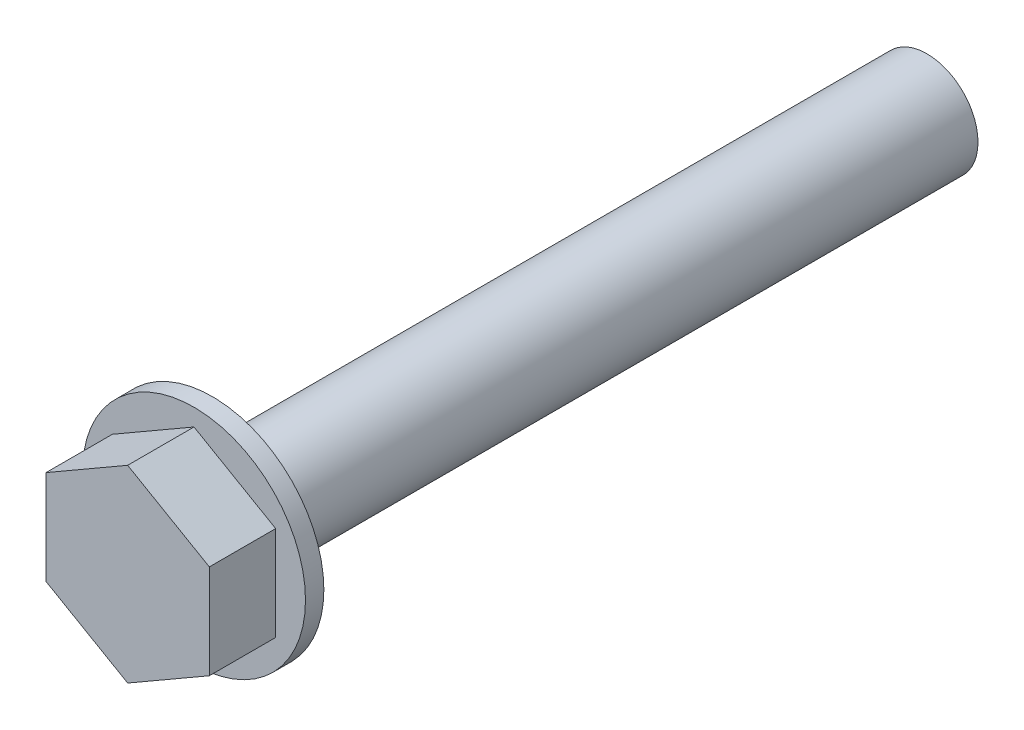
ISO-10303-21;
HEADER;
FILE_DESCRIPTION(('STEP AP214'),'2;1');
FILE_NAME('part.step','',(''),(''),'','','');
FILE_SCHEMA(('AUTOMOTIVE_DESIGN { 1 0 10303 214 1 1 1 1 }'));
ENDSEC;
DATA;
#1=APPLICATION_CONTEXT('core data for automotive mechanical design processes');
#2=APPLICATION_PROTOCOL_DEFINITION('international standard','automotive_design',2000,#1);
#3=PRODUCT_CONTEXT('',#1,'mechanical');
#4=PRODUCT('Part','Part','',(#3));
#5=PRODUCT_RELATED_PRODUCT_CATEGORY('part','',(#4));
#6=PRODUCT_DEFINITION_FORMATION('','',#4);
#7=PRODUCT_DEFINITION_CONTEXT('part definition',#1,'design');
#8=PRODUCT_DEFINITION('design','',#6,#7);
#9=PRODUCT_DEFINITION_SHAPE('','',#8);
#10=(LENGTH_UNIT() NAMED_UNIT(*) SI_UNIT(.MILLI.,.METRE.));
#11=(NAMED_UNIT(*) PLANE_ANGLE_UNIT() SI_UNIT($,.RADIAN.));
#12=(NAMED_UNIT(*) SI_UNIT($,.STERADIAN.) SOLID_ANGLE_UNIT());
#13=UNCERTAINTY_MEASURE_WITH_UNIT(LENGTH_MEASURE(1.E-05),#10,'distance_accuracy_value','');
#14=(GEOMETRIC_REPRESENTATION_CONTEXT(3) GLOBAL_UNCERTAINTY_ASSIGNED_CONTEXT((#13)) GLOBAL_UNIT_ASSIGNED_CONTEXT((#10,
#11,#12)) REPRESENTATION_CONTEXT('',''));
#15=CARTESIAN_POINT('',(0.,0.,0.));
#16=DIRECTION('',(0.,0.,1.));
#17=DIRECTION('',(1.,0.,0.));
#18=AXIS2_PLACEMENT_3D('',#15,#16,#17);
#19=CARTESIAN_POINT('',(0.,0.,1.8));
#20=DIRECTION('',(0.,0.,-1.));
#21=DIRECTION('',(-1.,0.,0.));
#22=AXIS2_PLACEMENT_3D('',#19,#20,#21);
#23=CYLINDRICAL_SURFACE('',#22,10.92);
#24=CARTESIAN_POINT('',(0.,0.,1.8));
#25=DIRECTION('',(0.,0.,1.));
#26=DIRECTION('',(1.,0.,0.));
#27=AXIS2_PLACEMENT_3D('',#24,#25,#26);
#28=CIRCLE('',#27,10.92);
#29=CARTESIAN_POINT('',(10.92,0.,1.8));
#30=VERTEX_POINT('',#29);
#31=EDGE_CURVE('E48',#30,#30,#28,.T.);
#32=ORIENTED_EDGE('',*,*,#31,.F.);
#33=EDGE_LOOP('',(#32));
#34=FACE_BOUND('',#33,.T.);
#35=CARTESIAN_POINT('',(0.,0.,0.));
#36=DIRECTION('',(0.,0.,1.));
#37=DIRECTION('',(1.,0.,0.));
#38=AXIS2_PLACEMENT_3D('',#35,#36,#37);
#39=CIRCLE('',#38,10.92);
#40=CARTESIAN_POINT('',(10.92,0.,0.));
#41=VERTEX_POINT('',#40);
#42=EDGE_CURVE('E117',#41,#41,#39,.T.);
#43=ORIENTED_EDGE('',*,*,#42,.T.);
#44=EDGE_LOOP('',(#43));
#45=FACE_BOUND('',#44,.T.);
#46=ADVANCED_FACE('F41',(#34,#45),#23,.T.);
#47=CARTESIAN_POINT('',(0.,0.,1.8));
#48=DIRECTION('',(0.,0.,1.));
#49=DIRECTION('',(1.,0.,0.));
#50=AXIS2_PLACEMENT_3D('',#47,#48,#49);
#51=PLANE('',#50);
#52=DIRECTION('',(0.,1.,0.));
#53=VECTOR('',#52,1.);
#54=CARTESIAN_POINT('',(8.,-4.618802153517,1.8));
#55=LINE('',#54,#53);
#56=CARTESIAN_POINT('',(8.,-4.618802153517,1.8));
#57=VERTEX_POINT('',#56);
#58=CARTESIAN_POINT('',(8.,4.61880215351701,1.8));
#59=VERTEX_POINT('',#58);
#60=EDGE_CURVE('E54',#57,#59,#55,.T.);
#61=ORIENTED_EDGE('',*,*,#60,.F.);
#62=DIRECTION('',(0.866025403784438,0.5,0.));
#63=VECTOR('',#62,1.);
#64=CARTESIAN_POINT('',(0.,-9.23760430703402,1.8));
#65=LINE('',#64,#63);
#66=CARTESIAN_POINT('',(0.,-9.23760430703402,1.8));
#67=VERTEX_POINT('',#66);
#68=EDGE_CURVE('E56',#67,#57,#65,.T.);
#69=ORIENTED_EDGE('',*,*,#68,.F.);
#70=DIRECTION('',(0.866025403784438,-0.5,0.));
#71=VECTOR('',#70,1.);
#72=CARTESIAN_POINT('',(-8.,-4.618802153517,1.8));
#73=LINE('',#72,#71);
#74=CARTESIAN_POINT('',(-8.,-4.618802153517,1.8));
#75=VERTEX_POINT('',#74);
#76=EDGE_CURVE('E254',#75,#67,#73,.T.);
#77=ORIENTED_EDGE('',*,*,#76,.F.);
#78=DIRECTION('',(0.,-1.,0.));
#79=VECTOR('',#78,1.);
#80=CARTESIAN_POINT('',(-8.,4.61880215351701,1.8));
#81=LINE('',#80,#79);
#82=CARTESIAN_POINT('',(-8.,4.61880215351701,1.8));
#83=VERTEX_POINT('',#82);
#84=EDGE_CURVE('E269',#83,#75,#81,.T.);
#85=ORIENTED_EDGE('',*,*,#84,.F.);
#86=DIRECTION('',(-0.866025403784439,-0.5,0.));
#87=VECTOR('',#86,1.);
#88=CARTESIAN_POINT('',(0.,9.23760430703402,1.8));
#89=LINE('',#88,#87);
#90=CARTESIAN_POINT('',(0.,9.23760430703402,1.8));
#91=VERTEX_POINT('',#90);
#92=EDGE_CURVE('E272',#91,#83,#89,.T.);
#93=ORIENTED_EDGE('',*,*,#92,.F.);
#94=DIRECTION('',(-0.866025403784439,0.5,0.));
#95=VECTOR('',#94,1.);
#96=CARTESIAN_POINT('',(8.,4.61880215351701,1.8));
#97=LINE('',#96,#95);
#98=EDGE_CURVE('E273',#59,#91,#97,.T.);
#99=ORIENTED_EDGE('',*,*,#98,.F.);
#100=EDGE_LOOP('',(#61,#69,#77,#85,#93,#99));
#101=FACE_BOUND('',#100,.T.);
#102=ORIENTED_EDGE('',*,*,#31,.T.);
#103=EDGE_LOOP('',(#102));
#104=FACE_BOUND('',#103,.T.);
#105=ADVANCED_FACE('F128',(#101,#104),#51,.T.);
#106=CARTESIAN_POINT('',(0.,0.,0.));
#107=DIRECTION('',(0.,0.,1.));
#108=DIRECTION('',(1.,0.,0.));
#109=AXIS2_PLACEMENT_3D('',#106,#107,#108);
#110=PLANE('',#109);
#111=CARTESIAN_POINT('',(0.,0.,0.));
#112=DIRECTION('',(0.,0.,1.));
#113=DIRECTION('',(1.,0.,0.));
#114=AXIS2_PLACEMENT_3D('',#111,#112,#113);
#115=CIRCLE('',#114,5.);
#116=CARTESIAN_POINT('',(5.,0.,0.));
#117=VERTEX_POINT('',#116);
#118=EDGE_CURVE('E11',#117,#117,#115,.F.);
#119=ORIENTED_EDGE('',*,*,#118,.F.);
#120=EDGE_LOOP('',(#119));
#121=FACE_BOUND('',#120,.T.);
#122=ORIENTED_EDGE('',*,*,#42,.F.);
#123=EDGE_LOOP('',(#122));
#124=FACE_BOUND('',#123,.T.);
#125=ADVANCED_FACE('F130',(#121,#124),#110,.F.);
#126=CARTESIAN_POINT('',(0.,0.,0.00999999999999612));
#127=DIRECTION('',(0.,0.,-1.));
#128=DIRECTION('',(-1.,0.,0.));
#129=AXIS2_PLACEMENT_3D('',#126,#127,#128);
#130=CYLINDRICAL_SURFACE('',#129,5.);
#131=CARTESIAN_POINT('',(0.,0.,-70.));
#132=DIRECTION('',(0.,0.,1.));
#133=DIRECTION('',(1.,0.,0.));
#134=AXIS2_PLACEMENT_3D('',#131,#132,#133);
#135=CIRCLE('',#134,5.);
#136=CARTESIAN_POINT('',(5.,0.,-70.));
#137=VERTEX_POINT('',#136);
#138=EDGE_CURVE('E114',#137,#137,#135,.T.);
#139=ORIENTED_EDGE('',*,*,#138,.T.);
#140=EDGE_LOOP('',(#139));
#141=FACE_BOUND('',#140,.T.);
#142=ORIENTED_EDGE('',*,*,#118,.T.);
#143=EDGE_LOOP('',(#142));
#144=FACE_BOUND('',#143,.T.);
#145=ADVANCED_FACE('F129',(#141,#144),#130,.T.);
#146=CARTESIAN_POINT('',(0.,0.,-70.));
#147=DIRECTION('',(0.,0.,1.));
#148=DIRECTION('',(1.,0.,0.));
#149=AXIS2_PLACEMENT_3D('',#146,#147,#148);
#150=PLANE('',#149);
#151=ORIENTED_EDGE('',*,*,#138,.F.);
#152=EDGE_LOOP('',(#151));
#153=FACE_BOUND('',#152,.T.);
#154=ADVANCED_FACE('F133',(#153),#150,.F.);
#155=CARTESIAN_POINT('',(8.,-4.618802153517,8.3));
#156=DIRECTION('',(-1.,0.,0.));
#157=DIRECTION('',(0.,0.,1.));
#158=AXIS2_PLACEMENT_3D('',#155,#156,#157);
#159=PLANE('',#158);
#160=ORIENTED_EDGE('',*,*,#60,.T.);
#161=DIRECTION('',(0.,0.,-1.));
#162=VECTOR('',#161,1.);
#163=CARTESIAN_POINT('',(8.,4.61880215351701,8.3));
#164=LINE('',#163,#162);
#165=CARTESIAN_POINT('',(8.,4.61880215351701,8.3));
#166=VERTEX_POINT('',#165);
#167=EDGE_CURVE('E96',#166,#59,#164,.T.);
#168=ORIENTED_EDGE('',*,*,#167,.F.);
#169=DIRECTION('',(0.,1.,0.));
#170=VECTOR('',#169,1.);
#171=CARTESIAN_POINT('',(8.,-4.618802153517,8.3));
#172=LINE('',#171,#170);
#173=CARTESIAN_POINT('',(8.,-4.618802153517,8.3));
#174=VERTEX_POINT('',#173);
#175=EDGE_CURVE('E105',#174,#166,#172,.T.);
#176=ORIENTED_EDGE('',*,*,#175,.F.);
#177=DIRECTION('',(0.,0.,-1.));
#178=VECTOR('',#177,1.);
#179=CARTESIAN_POINT('',(8.,-4.618802153517,8.3));
#180=LINE('',#179,#178);
#181=EDGE_CURVE('E252',#174,#57,#180,.T.);
#182=ORIENTED_EDGE('',*,*,#181,.T.);
#183=EDGE_LOOP('',(#160,#168,#176,#182));
#184=FACE_BOUND('',#183,.T.);
#185=ADVANCED_FACE('F115',(#184),#159,.F.);
#186=CARTESIAN_POINT('',(8.,4.61880215351701,8.3));
#187=DIRECTION('',(-0.5,-0.866025403784439,0.));
#188=DIRECTION('',(0.866025403784439,-0.5,0.));
#189=AXIS2_PLACEMENT_3D('',#186,#187,#188);
#190=PLANE('',#189);
#191=ORIENTED_EDGE('',*,*,#98,.T.);
#192=DIRECTION('',(0.,0.,-1.));
#193=VECTOR('',#192,1.);
#194=CARTESIAN_POINT('',(0.,9.23760430703402,8.3));
#195=LINE('',#194,#193);
#196=CARTESIAN_POINT('',(0.,9.23760430703402,8.3));
#197=VERTEX_POINT('',#196);
#198=EDGE_CURVE('E98',#197,#91,#195,.T.);
#199=ORIENTED_EDGE('',*,*,#198,.F.);
#200=DIRECTION('',(-0.866025403784439,0.5,0.));
#201=VECTOR('',#200,1.);
#202=CARTESIAN_POINT('',(8.,4.61880215351701,8.3));
#203=LINE('',#202,#201);
#204=EDGE_CURVE('E93',#166,#197,#203,.T.);
#205=ORIENTED_EDGE('',*,*,#204,.F.);
#206=ORIENTED_EDGE('',*,*,#167,.T.);
#207=EDGE_LOOP('',(#191,#199,#205,#206));
#208=FACE_BOUND('',#207,.T.);
#209=ADVANCED_FACE('F94',(#208),#190,.F.);
#210=CARTESIAN_POINT('',(0.,9.23760430703402,8.3));
#211=DIRECTION('',(0.5,-0.866025403784439,0.));
#212=DIRECTION('',(0.866025403784439,0.5,0.));
#213=AXIS2_PLACEMENT_3D('',#210,#211,#212);
#214=PLANE('',#213);
#215=ORIENTED_EDGE('',*,*,#92,.T.);
#216=DIRECTION('',(0.,0.,-1.));
#217=VECTOR('',#216,1.);
#218=CARTESIAN_POINT('',(-8.,4.61880215351701,8.3));
#219=LINE('',#218,#217);
#220=CARTESIAN_POINT('',(-8.,4.61880215351701,8.3));
#221=VERTEX_POINT('',#220);
#222=EDGE_CURVE('E119',#221,#83,#219,.T.);
#223=ORIENTED_EDGE('',*,*,#222,.F.);
#224=DIRECTION('',(-0.866025403784439,-0.5,0.));
#225=VECTOR('',#224,1.);
#226=CARTESIAN_POINT('',(0.,9.23760430703402,8.3));
#227=LINE('',#226,#225);
#228=EDGE_CURVE('E101',#197,#221,#227,.T.);
#229=ORIENTED_EDGE('',*,*,#228,.F.);
#230=ORIENTED_EDGE('',*,*,#198,.T.);
#231=EDGE_LOOP('',(#215,#223,#229,#230));
#232=FACE_BOUND('',#231,.T.);
#233=ADVANCED_FACE('F183',(#232),#214,.F.);
#234=CARTESIAN_POINT('',(-8.,4.61880215351701,8.3));
#235=DIRECTION('',(1.,0.,0.));
#236=DIRECTION('',(0.,1.,0.));
#237=AXIS2_PLACEMENT_3D('',#234,#235,#236);
#238=PLANE('',#237);
#239=ORIENTED_EDGE('',*,*,#84,.T.);
#240=DIRECTION('',(0.,0.,-1.));
#241=VECTOR('',#240,1.);
#242=CARTESIAN_POINT('',(-8.,-4.618802153517,8.3));
#243=LINE('',#242,#241);
#244=CARTESIAN_POINT('',(-8.,-4.618802153517,8.3));
#245=VERTEX_POINT('',#244);
#246=EDGE_CURVE('E256',#245,#75,#243,.T.);
#247=ORIENTED_EDGE('',*,*,#246,.F.);
#248=DIRECTION('',(0.,-1.,0.));
#249=VECTOR('',#248,1.);
#250=CARTESIAN_POINT('',(-8.,4.61880215351701,8.3));
#251=LINE('',#250,#249);
#252=EDGE_CURVE('E271',#221,#245,#251,.T.);
#253=ORIENTED_EDGE('',*,*,#252,.F.);
#254=ORIENTED_EDGE('',*,*,#222,.T.);
#255=EDGE_LOOP('',(#239,#247,#253,#254));
#256=FACE_BOUND('',#255,.T.);
#257=ADVANCED_FACE('F191',(#256),#238,.F.);
#258=CARTESIAN_POINT('',(-8.,-4.618802153517,8.3));
#259=DIRECTION('',(0.5,0.866025403784438,0.));
#260=DIRECTION('',(-0.866025403784439,0.5,0.));
#261=AXIS2_PLACEMENT_3D('',#258,#259,#260);
#262=PLANE('',#261);
#263=ORIENTED_EDGE('',*,*,#76,.T.);
#264=DIRECTION('',(0.,0.,-1.));
#265=VECTOR('',#264,1.);
#266=CARTESIAN_POINT('',(0.,-9.23760430703402,8.3));
#267=LINE('',#266,#265);
#268=CARTESIAN_POINT('',(0.,-9.23760430703402,8.3));
#269=VERTEX_POINT('',#268);
#270=EDGE_CURVE('E255',#269,#67,#267,.T.);
#271=ORIENTED_EDGE('',*,*,#270,.F.);
#272=DIRECTION('',(0.866025403784438,-0.5,0.));
#273=VECTOR('',#272,1.);
#274=CARTESIAN_POINT('',(-8.,-4.618802153517,8.3));
#275=LINE('',#274,#273);
#276=EDGE_CURVE('E257',#245,#269,#275,.T.);
#277=ORIENTED_EDGE('',*,*,#276,.F.);
#278=ORIENTED_EDGE('',*,*,#246,.T.);
#279=EDGE_LOOP('',(#263,#271,#277,#278));
#280=FACE_BOUND('',#279,.T.);
#281=ADVANCED_FACE('F206',(#280),#262,.F.);
#282=CARTESIAN_POINT('',(0.,-9.23760430703402,8.3));
#283=DIRECTION('',(-0.5,0.866025403784438,0.));
#284=DIRECTION('',(-0.866025403784439,-0.5,0.));
#285=AXIS2_PLACEMENT_3D('',#282,#283,#284);
#286=PLANE('',#285);
#287=ORIENTED_EDGE('',*,*,#68,.T.);
#288=ORIENTED_EDGE('',*,*,#181,.F.);
#289=DIRECTION('',(0.866025403784438,0.5,0.));
#290=VECTOR('',#289,1.);
#291=CARTESIAN_POINT('',(0.,-9.23760430703402,8.3));
#292=LINE('',#291,#290);
#293=EDGE_CURVE('E110',#269,#174,#292,.T.);
#294=ORIENTED_EDGE('',*,*,#293,.F.);
#295=ORIENTED_EDGE('',*,*,#270,.T.);
#296=EDGE_LOOP('',(#287,#288,#294,#295));
#297=FACE_BOUND('',#296,.T.);
#298=ADVANCED_FACE('F220',(#297),#286,.F.);
#299=CARTESIAN_POINT('',(0.,0.,8.3));
#300=DIRECTION('',(0.,0.,1.));
#301=DIRECTION('',(1.,0.,0.));
#302=AXIS2_PLACEMENT_3D('',#299,#300,#301);
#303=PLANE('',#302);
#304=ORIENTED_EDGE('',*,*,#175,.T.);
#305=ORIENTED_EDGE('',*,*,#204,.T.);
#306=ORIENTED_EDGE('',*,*,#228,.T.);
#307=ORIENTED_EDGE('',*,*,#252,.T.);
#308=ORIENTED_EDGE('',*,*,#276,.T.);
#309=ORIENTED_EDGE('',*,*,#293,.T.);
#310=EDGE_LOOP('',(#304,#305,#306,#307,#308,#309));
#311=FACE_BOUND('',#310,.T.);
#312=ADVANCED_FACE('F104',(#311),#303,.T.);
#313=CLOSED_SHELL('',(#46,#105,#125,#145,#154,#185,#209,#233,#257,#281,#298,#312));
#314=MANIFOLD_SOLID_BREP('B2',#313);
#315=ADVANCED_BREP_SHAPE_REPRESENTATION('',(#18,#314),#14);
#316=SHAPE_DEFINITION_REPRESENTATION(#9,#315);
ENDSEC;
END-ISO-10303-21;
